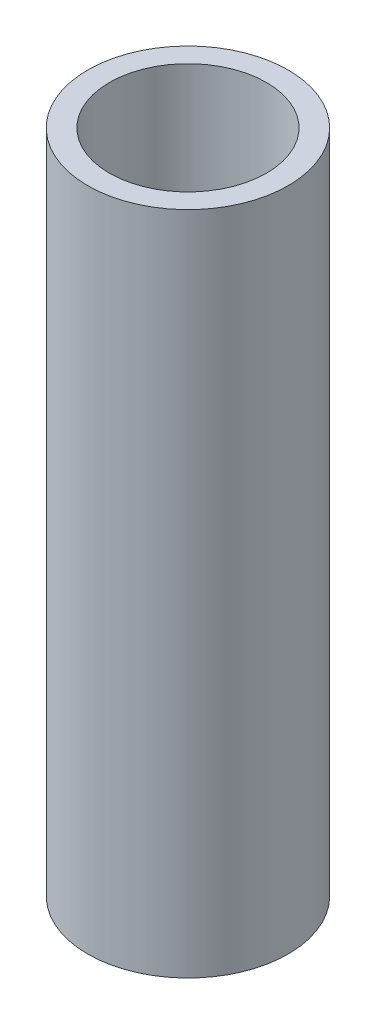
ISO-10303-21;
HEADER;
FILE_DESCRIPTION(('STEP AP214'),'2;1');
FILE_NAME('part.step','',(''),(''),'','','');
FILE_SCHEMA(('AUTOMOTIVE_DESIGN { 1 0 10303 214 1 1 1 1 }'));
ENDSEC;
DATA;
#1=APPLICATION_CONTEXT('core data for automotive mechanical design processes');
#2=APPLICATION_PROTOCOL_DEFINITION('international standard','automotive_design',2000,#1);
#3=PRODUCT_CONTEXT('',#1,'mechanical');
#4=PRODUCT('Part','Part','',(#3));
#5=PRODUCT_RELATED_PRODUCT_CATEGORY('part','',(#4));
#6=PRODUCT_DEFINITION_FORMATION('','',#4);
#7=PRODUCT_DEFINITION_CONTEXT('part definition',#1,'design');
#8=PRODUCT_DEFINITION('design','',#6,#7);
#9=PRODUCT_DEFINITION_SHAPE('','',#8);
#10=(LENGTH_UNIT() NAMED_UNIT(*) SI_UNIT(.MILLI.,.METRE.));
#11=(NAMED_UNIT(*) PLANE_ANGLE_UNIT() SI_UNIT($,.RADIAN.));
#12=(NAMED_UNIT(*) SI_UNIT($,.STERADIAN.) SOLID_ANGLE_UNIT());
#13=UNCERTAINTY_MEASURE_WITH_UNIT(LENGTH_MEASURE(1.E-05),#10,'distance_accuracy_value','');
#14=(GEOMETRIC_REPRESENTATION_CONTEXT(3) GLOBAL_UNCERTAINTY_ASSIGNED_CONTEXT((#13)) GLOBAL_UNIT_ASSIGNED_CONTEXT((#10,
#11,#12)) REPRESENTATION_CONTEXT('',''));
#15=CARTESIAN_POINT('',(0.,0.,0.));
#16=DIRECTION('',(0.,0.,1.));
#17=DIRECTION('',(1.,0.,0.));
#18=AXIS2_PLACEMENT_3D('',#15,#16,#17);
#19=CARTESIAN_POINT('',(0.,41.5,0.));
#20=DIRECTION('',(0.,-1.,0.));
#21=DIRECTION('',(0.,0.,-1.));
#22=AXIS2_PLACEMENT_3D('',#19,#20,#21);
#23=CYLINDRICAL_SURFACE('',#22,6.25);
#24=CARTESIAN_POINT('',(0.,41.5,0.));
#25=DIRECTION('',(0.,1.,0.));
#26=DIRECTION('',(0.,0.,1.));
#27=AXIS2_PLACEMENT_3D('',#24,#25,#26);
#28=CIRCLE('',#27,6.25);
#29=CARTESIAN_POINT('',(0.,41.5,6.25));
#30=VERTEX_POINT('',#29);
#31=EDGE_CURVE('E10',#30,#30,#28,.T.);
#32=ORIENTED_EDGE('',*,*,#31,.F.);
#33=EDGE_LOOP('',(#32));
#34=FACE_BOUND('',#33,.T.);
#35=CARTESIAN_POINT('',(0.,0.,0.));
#36=DIRECTION('',(0.,1.,0.));
#37=DIRECTION('',(0.,0.,1.));
#38=AXIS2_PLACEMENT_3D('',#35,#36,#37);
#39=CIRCLE('',#38,6.25);
#40=CARTESIAN_POINT('',(0.,0.,6.25));
#41=VERTEX_POINT('',#40);
#42=EDGE_CURVE('E38',#41,#41,#39,.T.);
#43=ORIENTED_EDGE('',*,*,#42,.T.);
#44=EDGE_LOOP('',(#43));
#45=FACE_BOUND('',#44,.T.);
#46=ADVANCED_FACE('F35',(#34,#45),#23,.T.);
#47=CARTESIAN_POINT('',(0.,41.5,0.));
#48=DIRECTION('',(0.,1.,0.));
#49=DIRECTION('',(0.,0.,1.));
#50=AXIS2_PLACEMENT_3D('',#47,#48,#49);
#51=PLANE('',#50);
#52=CARTESIAN_POINT('',(0.,41.5,0.));
#53=DIRECTION('',(0.,1.,0.));
#54=DIRECTION('',(0.,0.,1.));
#55=AXIS2_PLACEMENT_3D('',#52,#53,#54);
#56=CIRCLE('',#55,4.9);
#57=CARTESIAN_POINT('',(0.,41.5,4.9));
#58=VERTEX_POINT('',#57);
#59=EDGE_CURVE('E47',#58,#58,#56,.T.);
#60=ORIENTED_EDGE('',*,*,#59,.F.);
#61=EDGE_LOOP('',(#60));
#62=FACE_BOUND('',#61,.T.);
#63=ORIENTED_EDGE('',*,*,#31,.T.);
#64=EDGE_LOOP('',(#63));
#65=FACE_BOUND('',#64,.T.);
#66=ADVANCED_FACE('F62',(#62,#65),#51,.T.);
#67=CARTESIAN_POINT('',(0.,0.,0.));
#68=DIRECTION('',(0.,1.,0.));
#69=DIRECTION('',(0.,0.,1.));
#70=AXIS2_PLACEMENT_3D('',#67,#68,#69);
#71=PLANE('',#70);
#72=CARTESIAN_POINT('',(0.,0.,0.));
#73=DIRECTION('',(0.,1.,0.));
#74=DIRECTION('',(0.,0.,1.));
#75=AXIS2_PLACEMENT_3D('',#72,#73,#74);
#76=CIRCLE('',#75,4.9);
#77=CARTESIAN_POINT('',(0.,0.,4.9));
#78=VERTEX_POINT('',#77);
#79=EDGE_CURVE('E45',#78,#78,#76,.T.);
#80=ORIENTED_EDGE('',*,*,#79,.T.);
#81=EDGE_LOOP('',(#80));
#82=FACE_BOUND('',#81,.T.);
#83=ORIENTED_EDGE('',*,*,#42,.F.);
#84=EDGE_LOOP('',(#83));
#85=FACE_BOUND('',#84,.T.);
#86=ADVANCED_FACE('F53',(#82,#85),#71,.F.);
#87=CARTESIAN_POINT('',(0.,0.,0.));
#88=DIRECTION('',(0.,1.,0.));
#89=DIRECTION('',(0.,0.,1.));
#90=AXIS2_PLACEMENT_3D('',#87,#88,#89);
#91=CYLINDRICAL_SURFACE('',#90,4.9);
#92=ORIENTED_EDGE('',*,*,#79,.F.);
#93=EDGE_LOOP('',(#92));
#94=FACE_BOUND('',#93,.T.);
#95=ORIENTED_EDGE('',*,*,#59,.T.);
#96=EDGE_LOOP('',(#95));
#97=FACE_BOUND('',#96,.T.);
#98=ADVANCED_FACE('F56',(#94,#97),#91,.F.);
#99=CLOSED_SHELL('',(#46,#66,#86,#98));
#100=MANIFOLD_SOLID_BREP('B2',#99);
#101=ADVANCED_BREP_SHAPE_REPRESENTATION('',(#18,#100),#14);
#102=SHAPE_DEFINITION_REPRESENTATION(#9,#101);
ENDSEC;
END-ISO-10303-21;
